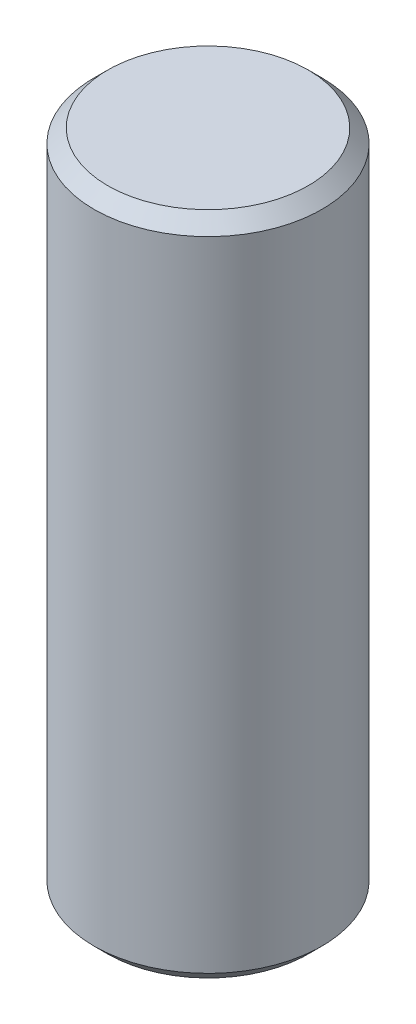
ISO-10303-21;
HEADER;
FILE_DESCRIPTION(('STEP AP214'),'2;1');
FILE_NAME('part.step','',(''),(''),'','','');
FILE_SCHEMA(('AUTOMOTIVE_DESIGN { 1 0 10303 214 1 1 1 1 }'));
ENDSEC;
DATA;
#1=APPLICATION_CONTEXT('core data for automotive mechanical design processes');
#2=APPLICATION_PROTOCOL_DEFINITION('international standard','automotive_design',2000,#1);
#3=PRODUCT_CONTEXT('',#1,'mechanical');
#4=PRODUCT('Part','Part','',(#3));
#5=PRODUCT_RELATED_PRODUCT_CATEGORY('part','',(#4));
#6=PRODUCT_DEFINITION_FORMATION('','',#4);
#7=PRODUCT_DEFINITION_CONTEXT('part definition',#1,'design');
#8=PRODUCT_DEFINITION('design','',#6,#7);
#9=PRODUCT_DEFINITION_SHAPE('','',#8);
#10=(LENGTH_UNIT() NAMED_UNIT(*) SI_UNIT(.MILLI.,.METRE.));
#11=(NAMED_UNIT(*) PLANE_ANGLE_UNIT() SI_UNIT($,.RADIAN.));
#12=(NAMED_UNIT(*) SI_UNIT($,.STERADIAN.) SOLID_ANGLE_UNIT());
#13=UNCERTAINTY_MEASURE_WITH_UNIT(LENGTH_MEASURE(1.E-05),#10,'distance_accuracy_value','');
#14=(GEOMETRIC_REPRESENTATION_CONTEXT(3) GLOBAL_UNCERTAINTY_ASSIGNED_CONTEXT((#13)) GLOBAL_UNIT_ASSIGNED_CONTEXT((#10,
#11,#12)) REPRESENTATION_CONTEXT('',''));
#15=CARTESIAN_POINT('',(0.,0.,0.));
#16=DIRECTION('',(0.,0.,1.));
#17=DIRECTION('',(1.,0.,0.));
#18=AXIS2_PLACEMENT_3D('',#15,#16,#17);
#19=CARTESIAN_POINT('',(0.,14.6,0.));
#20=DIRECTION('',(0.,-1.,0.));
#21=DIRECTION('',(0.,0.,-1.));
#22=AXIS2_PLACEMENT_3D('',#19,#20,#21);
#23=CYLINDRICAL_SURFACE('',#22,2.5);
#24=CARTESIAN_POINT('',(0.,0.300000000000002,0.));
#25=DIRECTION('',(0.,1.,0.));
#26=DIRECTION('',(0.,0.,1.));
#27=AXIS2_PLACEMENT_3D('',#24,#25,#26);
#28=CIRCLE('',#27,2.5);
#29=CARTESIAN_POINT('',(0.,0.300000000000002,2.5));
#30=VERTEX_POINT('',#29);
#31=EDGE_CURVE('E52',#30,#30,#28,.T.);
#32=ORIENTED_EDGE('',*,*,#31,.T.);
#33=EDGE_LOOP('',(#32));
#34=FACE_BOUND('',#33,.T.);
#35=CARTESIAN_POINT('',(0.,14.3,0.));
#36=DIRECTION('',(0.,1.,0.));
#37=DIRECTION('',(0.,0.,1.));
#38=AXIS2_PLACEMENT_3D('',#35,#36,#37);
#39=CIRCLE('',#38,2.5);
#40=CARTESIAN_POINT('',(0.,14.3,2.5));
#41=VERTEX_POINT('',#40);
#42=EDGE_CURVE('E57',#41,#41,#39,.F.);
#43=ORIENTED_EDGE('',*,*,#42,.T.);
#44=EDGE_LOOP('',(#43));
#45=FACE_BOUND('',#44,.T.);
#46=ADVANCED_FACE('F38',(#34,#45),#23,.T.);
#47=CARTESIAN_POINT('',(0.,14.6,0.));
#48=DIRECTION('',(0.,1.,0.));
#49=DIRECTION('',(0.,0.,1.));
#50=AXIS2_PLACEMENT_3D('',#47,#48,#49);
#51=PLANE('',#50);
#52=CARTESIAN_POINT('',(0.,14.6,0.));
#53=DIRECTION('',(0.,1.,0.));
#54=DIRECTION('',(0.,0.,1.));
#55=AXIS2_PLACEMENT_3D('',#52,#53,#54);
#56=CIRCLE('',#55,2.2);
#57=CARTESIAN_POINT('',(0.,14.6,2.2));
#58=VERTEX_POINT('',#57);
#59=EDGE_CURVE('E10',#58,#58,#56,.T.);
#60=ORIENTED_EDGE('',*,*,#59,.T.);
#61=EDGE_LOOP('',(#60));
#62=FACE_BOUND('',#61,.T.);
#63=ADVANCED_FACE('F74',(#62),#51,.T.);
#64=CARTESIAN_POINT('',(0.,0.,0.));
#65=DIRECTION('',(0.,1.,0.));
#66=DIRECTION('',(0.,0.,1.));
#67=AXIS2_PLACEMENT_3D('',#64,#65,#66);
#68=PLANE('',#67);
#69=CARTESIAN_POINT('',(0.,0.,0.));
#70=DIRECTION('',(0.,1.,0.));
#71=DIRECTION('',(0.,0.,1.));
#72=AXIS2_PLACEMENT_3D('',#69,#70,#71);
#73=CIRCLE('',#72,2.2);
#74=CARTESIAN_POINT('',(0.,0.,2.2));
#75=VERTEX_POINT('',#74);
#76=EDGE_CURVE('E47',#75,#75,#73,.F.);
#77=ORIENTED_EDGE('',*,*,#76,.T.);
#78=EDGE_LOOP('',(#77));
#79=FACE_BOUND('',#78,.T.);
#80=ADVANCED_FACE('F71',(#79),#68,.F.);
#81=CARTESIAN_POINT('',(0.,0.300000000000002,0.));
#82=DIRECTION('',(0.,1.,0.));
#83=DIRECTION('',(0.,0.,1.));
#84=AXIS2_PLACEMENT_3D('',#81,#82,#83);
#85=CONICAL_SURFACE('',#84,2.5,0.785398163397444);
#86=ORIENTED_EDGE('',*,*,#76,.F.);
#87=EDGE_LOOP('',(#86));
#88=FACE_BOUND('',#87,.T.);
#89=ORIENTED_EDGE('',*,*,#31,.F.);
#90=EDGE_LOOP('',(#89));
#91=FACE_BOUND('',#90,.T.);
#92=ADVANCED_FACE('F67',(#88,#91),#85,.T.);
#93=CARTESIAN_POINT('',(0.,14.6,0.));
#94=DIRECTION('',(0.,-1.,0.));
#95=DIRECTION('',(0.,0.,-1.));
#96=AXIS2_PLACEMENT_3D('',#93,#94,#95);
#97=CONICAL_SURFACE('',#96,2.2,0.785398163397447);
#98=ORIENTED_EDGE('',*,*,#42,.F.);
#99=EDGE_LOOP('',(#98));
#100=FACE_BOUND('',#99,.T.);
#101=ORIENTED_EDGE('',*,*,#59,.F.);
#102=EDGE_LOOP('',(#101));
#103=FACE_BOUND('',#102,.T.);
#104=ADVANCED_FACE('F41',(#100,#103),#97,.T.);
#105=CLOSED_SHELL('',(#46,#63,#80,#92,#104));
#106=MANIFOLD_SOLID_BREP('B2',#105);
#107=ADVANCED_BREP_SHAPE_REPRESENTATION('',(#18,#106),#14);
#108=SHAPE_DEFINITION_REPRESENTATION(#9,#107);
ENDSEC;
END-ISO-10303-21;
